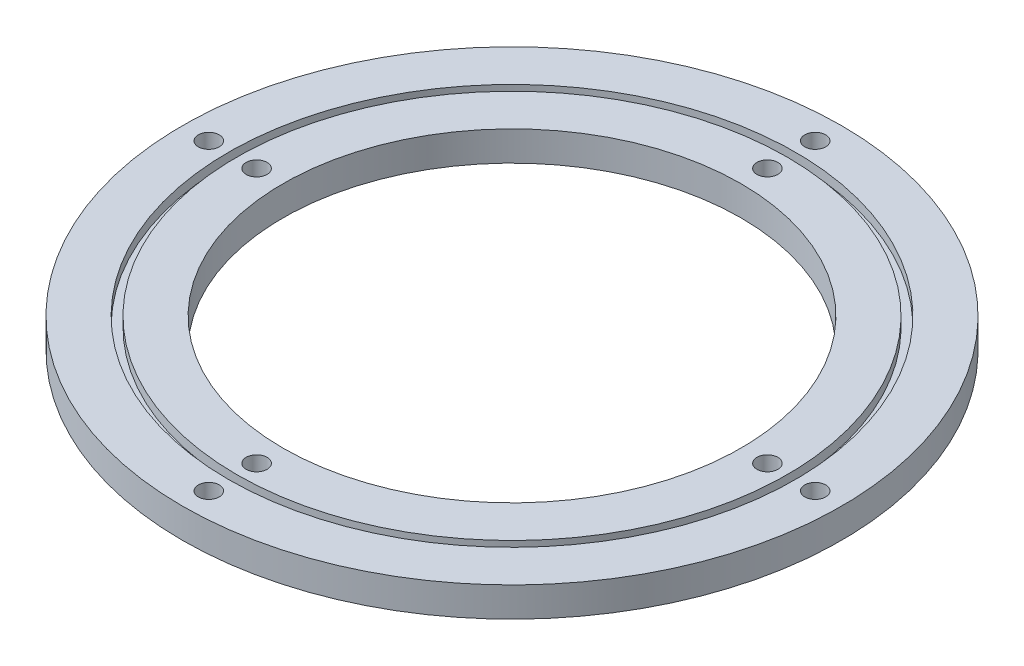
ISO-10303-21;
HEADER;
FILE_DESCRIPTION(('STEP AP214'),'2;1');
FILE_NAME('part.step','',(''),(''),'','','');
FILE_SCHEMA(('AUTOMOTIVE_DESIGN { 1 0 10303 214 1 1 1 1 }'));
ENDSEC;
DATA;
#1=APPLICATION_CONTEXT('core data for automotive mechanical design processes');
#2=APPLICATION_PROTOCOL_DEFINITION('international standard','automotive_design',2000,#1);
#3=PRODUCT_CONTEXT('',#1,'mechanical');
#4=PRODUCT('Part','Part','',(#3));
#5=PRODUCT_RELATED_PRODUCT_CATEGORY('part','',(#4));
#6=PRODUCT_DEFINITION_FORMATION('','',#4);
#7=PRODUCT_DEFINITION_CONTEXT('part definition',#1,'design');
#8=PRODUCT_DEFINITION('design','',#6,#7);
#9=PRODUCT_DEFINITION_SHAPE('','',#8);
#10=(LENGTH_UNIT() NAMED_UNIT(*) SI_UNIT(.MILLI.,.METRE.));
#11=(NAMED_UNIT(*) PLANE_ANGLE_UNIT() SI_UNIT($,.RADIAN.));
#12=(NAMED_UNIT(*) SI_UNIT($,.STERADIAN.) SOLID_ANGLE_UNIT());
#13=UNCERTAINTY_MEASURE_WITH_UNIT(LENGTH_MEASURE(1.E-05),#10,'distance_accuracy_value','');
#14=(GEOMETRIC_REPRESENTATION_CONTEXT(3) GLOBAL_UNCERTAINTY_ASSIGNED_CONTEXT((#13)) GLOBAL_UNIT_ASSIGNED_CONTEXT((#10,
#11,#12)) REPRESENTATION_CONTEXT('',''));
#15=CARTESIAN_POINT('',(0.,0.,0.));
#16=DIRECTION('',(0.,0.,1.));
#17=DIRECTION('',(1.,0.,0.));
#18=AXIS2_PLACEMENT_3D('',#15,#16,#17);
#19=CARTESIAN_POINT('',(0.,4.5,0.));
#20=DIRECTION('',(0.,-1.,0.));
#21=DIRECTION('',(0.,0.,-1.));
#22=AXIS2_PLACEMENT_3D('',#19,#20,#21);
#23=CYLINDRICAL_SURFACE('',#22,86.02);
#24=CARTESIAN_POINT('',(0.,-4.5,0.));
#25=DIRECTION('',(0.,1.,0.));
#26=DIRECTION('',(0.,0.,1.));
#27=AXIS2_PLACEMENT_3D('',#24,#25,#26);
#28=CIRCLE('',#27,86.02);
#29=CARTESIAN_POINT('',(0.,-4.5,86.02));
#30=VERTEX_POINT('',#29);
#31=EDGE_CURVE('E65',#30,#30,#28,.T.);
#32=ORIENTED_EDGE('',*,*,#31,.F.);
#33=EDGE_LOOP('',(#32));
#34=FACE_BOUND('',#33,.T.);
#35=CARTESIAN_POINT('',(0.,-1.5875,0.));
#36=DIRECTION('',(0.,1.,0.));
#37=DIRECTION('',(0.,0.,1.));
#38=AXIS2_PLACEMENT_3D('',#35,#36,#37);
#39=CIRCLE('',#38,86.02);
#40=CARTESIAN_POINT('',(0.,-1.5875,86.02));
#41=VERTEX_POINT('',#40);
#42=EDGE_CURVE('E87',#41,#41,#39,.T.);
#43=ORIENTED_EDGE('',*,*,#42,.T.);
#44=EDGE_LOOP('',(#43));
#45=FACE_BOUND('',#44,.T.);
#46=ADVANCED_FACE('F38',(#34,#45),#23,.F.);
#47=CARTESIAN_POINT('',(0.,4.5,92.));
#48=DIRECTION('',(0.,-1.,0.));
#49=DIRECTION('',(0.,0.,-1.));
#50=AXIS2_PLACEMENT_3D('',#47,#48,#49);
#51=CYLINDRICAL_SURFACE('',#50,3.175);
#52=CARTESIAN_POINT('',(0.,4.5,92.));
#53=DIRECTION('',(0.,1.,0.));
#54=DIRECTION('',(0.,0.,1.));
#55=AXIS2_PLACEMENT_3D('',#52,#53,#54);
#56=CIRCLE('',#55,3.175);
#57=CARTESIAN_POINT('',(0.,4.5,95.175));
#58=VERTEX_POINT('',#57);
#59=EDGE_CURVE('E49',#58,#58,#56,.F.);
#60=ORIENTED_EDGE('',*,*,#59,.F.);
#61=EDGE_LOOP('',(#60));
#62=FACE_BOUND('',#61,.T.);
#63=CARTESIAN_POINT('',(0.,-4.5,92.));
#64=DIRECTION('',(0.,1.,0.));
#65=DIRECTION('',(0.,0.,1.));
#66=AXIS2_PLACEMENT_3D('',#63,#64,#65);
#67=CIRCLE('',#66,3.175);
#68=CARTESIAN_POINT('',(0.,-4.5,95.175));
#69=VERTEX_POINT('',#68);
#70=EDGE_CURVE('E71',#69,#69,#67,.F.);
#71=ORIENTED_EDGE('',*,*,#70,.T.);
#72=EDGE_LOOP('',(#71));
#73=FACE_BOUND('',#72,.T.);
#74=ADVANCED_FACE('F101',(#62,#73),#51,.F.);
#75=CARTESIAN_POINT('',(0.,4.5,0.));
#76=DIRECTION('',(0.,-1.,0.));
#77=DIRECTION('',(0.,0.,-1.));
#78=AXIS2_PLACEMENT_3D('',#75,#76,#77);
#79=CYLINDRICAL_SURFACE('',#78,100.);
#80=CARTESIAN_POINT('',(0.,4.5,0.));
#81=DIRECTION('',(0.,1.,0.));
#82=DIRECTION('',(0.,0.,1.));
#83=AXIS2_PLACEMENT_3D('',#80,#81,#82);
#84=CIRCLE('',#83,100.);
#85=CARTESIAN_POINT('',(0.,4.5,100.));
#86=VERTEX_POINT('',#85);
#87=EDGE_CURVE('E54',#86,#86,#84,.T.);
#88=ORIENTED_EDGE('',*,*,#87,.F.);
#89=EDGE_LOOP('',(#88));
#90=FACE_BOUND('',#89,.T.);
#91=CARTESIAN_POINT('',(0.,-4.5,0.));
#92=DIRECTION('',(0.,1.,0.));
#93=DIRECTION('',(0.,0.,1.));
#94=AXIS2_PLACEMENT_3D('',#91,#92,#93);
#95=CIRCLE('',#94,100.);
#96=CARTESIAN_POINT('',(0.,-4.5,100.));
#97=VERTEX_POINT('',#96);
#98=EDGE_CURVE('E68',#97,#97,#95,.T.);
#99=ORIENTED_EDGE('',*,*,#98,.T.);
#100=EDGE_LOOP('',(#99));
#101=FACE_BOUND('',#100,.T.);
#102=ADVANCED_FACE('F97',(#90,#101),#79,.T.);
#103=CARTESIAN_POINT('',(0.,1.5875,0.));
#104=DIRECTION('',(0.,1.,0.));
#105=DIRECTION('',(0.,0.,1.));
#106=AXIS2_PLACEMENT_3D('',#103,#104,#105);
#107=CIRCLE('',#106,86.02);
#108=CARTESIAN_POINT('',(0.,1.5875,86.02));
#109=VERTEX_POINT('',#108);
#110=EDGE_CURVE('E11',#109,#109,#107,.T.);
#111=ORIENTED_EDGE('',*,*,#110,.F.);
#112=EDGE_LOOP('',(#111));
#113=FACE_BOUND('',#112,.T.);
#114=CARTESIAN_POINT('',(0.,4.5,0.));
#115=DIRECTION('',(0.,1.,0.));
#116=DIRECTION('',(0.,0.,1.));
#117=AXIS2_PLACEMENT_3D('',#114,#115,#116);
#118=CIRCLE('',#117,86.02);
#119=CARTESIAN_POINT('',(0.,4.5,86.02));
#120=VERTEX_POINT('',#119);
#121=EDGE_CURVE('E84',#120,#120,#118,.T.);
#122=ORIENTED_EDGE('',*,*,#121,.T.);
#123=EDGE_LOOP('',(#122));
#124=FACE_BOUND('',#123,.T.);
#125=ADVANCED_FACE('F100',(#113,#124),#23,.F.);
#126=CARTESIAN_POINT('',(92.,4.5,0.));
#127=DIRECTION('',(0.,-1.,0.));
#128=DIRECTION('',(0.,0.,-1.));
#129=AXIS2_PLACEMENT_3D('',#126,#127,#128);
#130=CYLINDRICAL_SURFACE('',#129,3.175);
#131=CARTESIAN_POINT('',(92.,4.5,0.));
#132=DIRECTION('',(0.,1.,0.));
#133=DIRECTION('',(0.,0.,1.));
#134=AXIS2_PLACEMENT_3D('',#131,#132,#133);
#135=CIRCLE('',#134,3.175);
#136=CARTESIAN_POINT('',(92.,4.5,3.175));
#137=VERTEX_POINT('',#136);
#138=EDGE_CURVE('E79',#137,#137,#135,.F.);
#139=ORIENTED_EDGE('',*,*,#138,.F.);
#140=EDGE_LOOP('',(#139));
#141=FACE_BOUND('',#140,.T.);
#142=CARTESIAN_POINT('',(92.,-4.5,0.));
#143=DIRECTION('',(0.,1.,0.));
#144=DIRECTION('',(0.,0.,1.));
#145=AXIS2_PLACEMENT_3D('',#142,#143,#144);
#146=CIRCLE('',#145,3.175);
#147=CARTESIAN_POINT('',(92.,-4.5,3.175));
#148=VERTEX_POINT('',#147);
#149=EDGE_CURVE('E61',#148,#148,#146,.F.);
#150=ORIENTED_EDGE('',*,*,#149,.T.);
#151=EDGE_LOOP('',(#150));
#152=FACE_BOUND('',#151,.T.);
#153=ADVANCED_FACE('F126',(#141,#152),#130,.F.);
#154=CARTESIAN_POINT('',(-92.,4.5,0.));
#155=DIRECTION('',(0.,-1.,0.));
#156=DIRECTION('',(0.,0.,-1.));
#157=AXIS2_PLACEMENT_3D('',#154,#155,#156);
#158=CYLINDRICAL_SURFACE('',#157,3.175);
#159=CARTESIAN_POINT('',(-92.,4.5,0.));
#160=DIRECTION('',(0.,1.,0.));
#161=DIRECTION('',(0.,0.,1.));
#162=AXIS2_PLACEMENT_3D('',#159,#160,#161);
#163=CIRCLE('',#162,3.175);
#164=CARTESIAN_POINT('',(-92.,4.5,3.17500000000001));
#165=VERTEX_POINT('',#164);
#166=EDGE_CURVE('E75',#165,#165,#163,.F.);
#167=ORIENTED_EDGE('',*,*,#166,.F.);
#168=EDGE_LOOP('',(#167));
#169=FACE_BOUND('',#168,.T.);
#170=CARTESIAN_POINT('',(-92.,-4.5,0.));
#171=DIRECTION('',(0.,1.,0.));
#172=DIRECTION('',(0.,0.,1.));
#173=AXIS2_PLACEMENT_3D('',#170,#171,#172);
#174=CIRCLE('',#173,3.175);
#175=CARTESIAN_POINT('',(-92.,-4.5,3.17500000000001));
#176=VERTEX_POINT('',#175);
#177=EDGE_CURVE('E58',#176,#176,#174,.F.);
#178=ORIENTED_EDGE('',*,*,#177,.T.);
#179=EDGE_LOOP('',(#178));
#180=FACE_BOUND('',#179,.T.);
#181=ADVANCED_FACE('F40',(#169,#180),#158,.F.);
#182=CARTESIAN_POINT('',(0.,4.5,-92.));
#183=DIRECTION('',(0.,-1.,0.));
#184=DIRECTION('',(0.,0.,-1.));
#185=AXIS2_PLACEMENT_3D('',#182,#183,#184);
#186=CYLINDRICAL_SURFACE('',#185,3.17499999999999);
#187=CARTESIAN_POINT('',(0.,4.5,-92.));
#188=DIRECTION('',(0.,1.,0.));
#189=DIRECTION('',(0.,0.,1.));
#190=AXIS2_PLACEMENT_3D('',#187,#188,#189);
#191=CIRCLE('',#190,3.17499999999999);
#192=CARTESIAN_POINT('',(0.,4.5,-88.825));
#193=VERTEX_POINT('',#192);
#194=EDGE_CURVE('E45',#193,#193,#191,.F.);
#195=ORIENTED_EDGE('',*,*,#194,.F.);
#196=EDGE_LOOP('',(#195));
#197=FACE_BOUND('',#196,.T.);
#198=CARTESIAN_POINT('',(0.,-4.5,-92.));
#199=DIRECTION('',(0.,1.,0.));
#200=DIRECTION('',(0.,0.,1.));
#201=AXIS2_PLACEMENT_3D('',#198,#199,#200);
#202=CIRCLE('',#201,3.17499999999999);
#203=CARTESIAN_POINT('',(0.,-4.5,-88.825));
#204=VERTEX_POINT('',#203);
#205=EDGE_CURVE('E73',#204,#204,#202,.F.);
#206=ORIENTED_EDGE('',*,*,#205,.T.);
#207=EDGE_LOOP('',(#206));
#208=FACE_BOUND('',#207,.T.);
#209=ADVANCED_FACE('F124',(#197,#208),#186,.F.);
#210=CARTESIAN_POINT('',(0.,4.5,0.));
#211=DIRECTION('',(0.,1.,0.));
#212=DIRECTION('',(0.,0.,1.));
#213=AXIS2_PLACEMENT_3D('',#210,#211,#212);
#214=PLANE('',#213);
#215=ORIENTED_EDGE('',*,*,#166,.T.);
#216=EDGE_LOOP('',(#215));
#217=FACE_BOUND('',#216,.T.);
#218=ORIENTED_EDGE('',*,*,#138,.T.);
#219=EDGE_LOOP('',(#218));
#220=FACE_BOUND('',#219,.T.);
#221=ORIENTED_EDGE('',*,*,#121,.F.);
#222=EDGE_LOOP('',(#221));
#223=FACE_BOUND('',#222,.T.);
#224=ORIENTED_EDGE('',*,*,#87,.T.);
#225=EDGE_LOOP('',(#224));
#226=FACE_BOUND('',#225,.T.);
#227=ORIENTED_EDGE('',*,*,#59,.T.);
#228=EDGE_LOOP('',(#227));
#229=FACE_BOUND('',#228,.T.);
#230=ORIENTED_EDGE('',*,*,#194,.T.);
#231=EDGE_LOOP('',(#230));
#232=FACE_BOUND('',#231,.T.);
#233=ADVANCED_FACE('F94',(#217,#220,#223,#226,#229,#232),#214,.T.);
#234=CARTESIAN_POINT('',(0.,-4.5,0.));
#235=DIRECTION('',(0.,1.,0.));
#236=DIRECTION('',(0.,0.,1.));
#237=AXIS2_PLACEMENT_3D('',#234,#235,#236);
#238=PLANE('',#237);
#239=ORIENTED_EDGE('',*,*,#177,.F.);
#240=EDGE_LOOP('',(#239));
#241=FACE_BOUND('',#240,.T.);
#242=ORIENTED_EDGE('',*,*,#149,.F.);
#243=EDGE_LOOP('',(#242));
#244=FACE_BOUND('',#243,.T.);
#245=ORIENTED_EDGE('',*,*,#31,.T.);
#246=EDGE_LOOP('',(#245));
#247=FACE_BOUND('',#246,.T.);
#248=ORIENTED_EDGE('',*,*,#98,.F.);
#249=EDGE_LOOP('',(#248));
#250=FACE_BOUND('',#249,.T.);
#251=ORIENTED_EDGE('',*,*,#70,.F.);
#252=EDGE_LOOP('',(#251));
#253=FACE_BOUND('',#252,.T.);
#254=ORIENTED_EDGE('',*,*,#205,.F.);
#255=EDGE_LOOP('',(#254));
#256=FACE_BOUND('',#255,.T.);
#257=ADVANCED_FACE('F105',(#241,#244,#247,#250,#253,#256),#238,.F.);
#258=CARTESIAN_POINT('',(0.,1.5875,0.));
#259=DIRECTION('',(0.,1.,0.));
#260=DIRECTION('',(0.,0.,1.));
#261=AXIS2_PLACEMENT_3D('',#258,#259,#260);
#262=PLANE('',#261);
#263=CARTESIAN_POINT('',(0.,1.5875,0.));
#264=DIRECTION('',(0.,1.,0.));
#265=DIRECTION('',(0.,0.,1.));
#266=AXIS2_PLACEMENT_3D('',#263,#264,#265);
#267=CIRCLE('',#266,83.48);
#268=CARTESIAN_POINT('',(0.,1.5875,83.48));
#269=VERTEX_POINT('',#268);
#270=EDGE_CURVE('E62',#269,#269,#267,.T.);
#271=ORIENTED_EDGE('',*,*,#270,.F.);
#272=EDGE_LOOP('',(#271));
#273=FACE_BOUND('',#272,.T.);
#274=ORIENTED_EDGE('',*,*,#110,.T.);
#275=EDGE_LOOP('',(#274));
#276=FACE_BOUND('',#275,.T.);
#277=ADVANCED_FACE('F108',(#273,#276),#262,.T.);
#278=CARTESIAN_POINT('',(0.,-1.5875,0.));
#279=DIRECTION('',(0.,1.,0.));
#280=DIRECTION('',(0.,0.,1.));
#281=AXIS2_PLACEMENT_3D('',#278,#279,#280);
#282=PLANE('',#281);
#283=CARTESIAN_POINT('',(0.,-1.5875,0.));
#284=DIRECTION('',(0.,1.,0.));
#285=DIRECTION('',(0.,0.,1.));
#286=AXIS2_PLACEMENT_3D('',#283,#284,#285);
#287=CIRCLE('',#286,83.48);
#288=CARTESIAN_POINT('',(0.,-1.5875,83.48));
#289=VERTEX_POINT('',#288);
#290=EDGE_CURVE('E144',#289,#289,#287,.F.);
#291=ORIENTED_EDGE('',*,*,#290,.F.);
#292=EDGE_LOOP('',(#291));
#293=FACE_BOUND('',#292,.T.);
#294=ORIENTED_EDGE('',*,*,#42,.F.);
#295=EDGE_LOOP('',(#294));
#296=FACE_BOUND('',#295,.T.);
#297=ADVANCED_FACE('F220',(#293,#296),#282,.F.);
#298=CARTESIAN_POINT('',(0.,4.5,0.));
#299=DIRECTION('',(0.,-1.,0.));
#300=DIRECTION('',(0.,0.,-1.));
#301=AXIS2_PLACEMENT_3D('',#298,#299,#300);
#302=CYLINDRICAL_SURFACE('',#301,83.48);
#303=CARTESIAN_POINT('',(0.,-4.5,0.));
#304=DIRECTION('',(0.,1.,0.));
#305=DIRECTION('',(0.,0.,1.));
#306=AXIS2_PLACEMENT_3D('',#303,#304,#305);
#307=CIRCLE('',#306,83.48);
#308=CARTESIAN_POINT('',(0.,-4.5,83.48));
#309=VERTEX_POINT('',#308);
#310=EDGE_CURVE('E155',#309,#309,#307,.T.);
#311=ORIENTED_EDGE('',*,*,#310,.T.);
#312=EDGE_LOOP('',(#311));
#313=FACE_BOUND('',#312,.T.);
#314=ORIENTED_EDGE('',*,*,#290,.T.);
#315=EDGE_LOOP('',(#314));
#316=FACE_BOUND('',#315,.T.);
#317=ADVANCED_FACE('F210',(#313,#316),#302,.T.);
#318=CARTESIAN_POINT('',(0.,4.5,0.));
#319=DIRECTION('',(0.,-1.,0.));
#320=DIRECTION('',(0.,0.,-1.));
#321=AXIS2_PLACEMENT_3D('',#318,#319,#320);
#322=CYLINDRICAL_SURFACE('',#321,69.5);
#323=CARTESIAN_POINT('',(0.,4.5,0.));
#324=DIRECTION('',(0.,1.,0.));
#325=DIRECTION('',(0.,0.,1.));
#326=AXIS2_PLACEMENT_3D('',#323,#324,#325);
#327=CIRCLE('',#326,69.5);
#328=CARTESIAN_POINT('',(0.,4.5,69.5));
#329=VERTEX_POINT('',#328);
#330=EDGE_CURVE('E152',#329,#329,#327,.T.);
#331=ORIENTED_EDGE('',*,*,#330,.T.);
#332=EDGE_LOOP('',(#331));
#333=FACE_BOUND('',#332,.T.);
#334=CARTESIAN_POINT('',(0.,-4.5,0.));
#335=DIRECTION('',(0.,1.,0.));
#336=DIRECTION('',(0.,0.,1.));
#337=AXIS2_PLACEMENT_3D('',#334,#335,#336);
#338=CIRCLE('',#337,69.5);
#339=CARTESIAN_POINT('',(0.,-4.5,69.5));
#340=VERTEX_POINT('',#339);
#341=EDGE_CURVE('E159',#340,#340,#338,.T.);
#342=ORIENTED_EDGE('',*,*,#341,.F.);
#343=EDGE_LOOP('',(#342));
#344=FACE_BOUND('',#343,.T.);
#345=ADVANCED_FACE('F219',(#333,#344),#322,.F.);
#346=CARTESIAN_POINT('',(77.5,4.5,0.));
#347=DIRECTION('',(0.,-1.,0.));
#348=DIRECTION('',(0.,0.,-1.));
#349=AXIS2_PLACEMENT_3D('',#346,#347,#348);
#350=CYLINDRICAL_SURFACE('',#349,3.175);
#351=CARTESIAN_POINT('',(77.5,4.5,0.));
#352=DIRECTION('',(0.,1.,0.));
#353=DIRECTION('',(0.,0.,1.));
#354=AXIS2_PLACEMENT_3D('',#351,#352,#353);
#355=CIRCLE('',#354,3.175);
#356=CARTESIAN_POINT('',(77.5,4.5,3.175));
#357=VERTEX_POINT('',#356);
#358=EDGE_CURVE('E176',#357,#357,#355,.T.);
#359=ORIENTED_EDGE('',*,*,#358,.T.);
#360=EDGE_LOOP('',(#359));
#361=FACE_BOUND('',#360,.T.);
#362=CARTESIAN_POINT('',(77.5,-4.5,0.));
#363=DIRECTION('',(0.,1.,0.));
#364=DIRECTION('',(0.,0.,1.));
#365=AXIS2_PLACEMENT_3D('',#362,#363,#364);
#366=CIRCLE('',#365,3.175);
#367=CARTESIAN_POINT('',(77.5,-4.5,3.175));
#368=VERTEX_POINT('',#367);
#369=EDGE_CURVE('E162',#368,#368,#366,.T.);
#370=ORIENTED_EDGE('',*,*,#369,.F.);
#371=EDGE_LOOP('',(#370));
#372=FACE_BOUND('',#371,.T.);
#373=ADVANCED_FACE('F226',(#361,#372),#350,.F.);
#374=CARTESIAN_POINT('',(0.,4.5,77.5));
#375=DIRECTION('',(0.,-1.,0.));
#376=DIRECTION('',(0.,0.,-1.));
#377=AXIS2_PLACEMENT_3D('',#374,#375,#376);
#378=CYLINDRICAL_SURFACE('',#377,3.17499999999999);
#379=CARTESIAN_POINT('',(0.,4.5,77.5));
#380=DIRECTION('',(0.,1.,0.));
#381=DIRECTION('',(0.,0.,1.));
#382=AXIS2_PLACEMENT_3D('',#379,#380,#381);
#383=CIRCLE('',#382,3.17499999999999);
#384=CARTESIAN_POINT('',(0.,4.5,80.675));
#385=VERTEX_POINT('',#384);
#386=EDGE_CURVE('E179',#385,#385,#383,.T.);
#387=ORIENTED_EDGE('',*,*,#386,.T.);
#388=EDGE_LOOP('',(#387));
#389=FACE_BOUND('',#388,.T.);
#390=CARTESIAN_POINT('',(0.,-4.5,77.5));
#391=DIRECTION('',(0.,1.,0.));
#392=DIRECTION('',(0.,0.,1.));
#393=AXIS2_PLACEMENT_3D('',#390,#391,#392);
#394=CIRCLE('',#393,3.17499999999999);
#395=CARTESIAN_POINT('',(0.,-4.5,80.675));
#396=VERTEX_POINT('',#395);
#397=EDGE_CURVE('E165',#396,#396,#394,.T.);
#398=ORIENTED_EDGE('',*,*,#397,.F.);
#399=EDGE_LOOP('',(#398));
#400=FACE_BOUND('',#399,.T.);
#401=ADVANCED_FACE('F248',(#389,#400),#378,.F.);
#402=CARTESIAN_POINT('',(-77.5,4.5,0.));
#403=DIRECTION('',(0.,-1.,0.));
#404=DIRECTION('',(0.,0.,-1.));
#405=AXIS2_PLACEMENT_3D('',#402,#403,#404);
#406=CYLINDRICAL_SURFACE('',#405,3.175);
#407=CARTESIAN_POINT('',(-77.5,4.5,0.));
#408=DIRECTION('',(0.,1.,0.));
#409=DIRECTION('',(0.,0.,1.));
#410=AXIS2_PLACEMENT_3D('',#407,#408,#409);
#411=CIRCLE('',#410,3.175);
#412=CARTESIAN_POINT('',(-77.5,4.5,3.17500000000001));
#413=VERTEX_POINT('',#412);
#414=EDGE_CURVE('E182',#413,#413,#411,.T.);
#415=ORIENTED_EDGE('',*,*,#414,.T.);
#416=EDGE_LOOP('',(#415));
#417=FACE_BOUND('',#416,.T.);
#418=CARTESIAN_POINT('',(-77.5,-4.5,0.));
#419=DIRECTION('',(0.,1.,0.));
#420=DIRECTION('',(0.,0.,1.));
#421=AXIS2_PLACEMENT_3D('',#418,#419,#420);
#422=CIRCLE('',#421,3.175);
#423=CARTESIAN_POINT('',(-77.5,-4.5,3.17500000000001));
#424=VERTEX_POINT('',#423);
#425=EDGE_CURVE('E168',#424,#424,#422,.T.);
#426=ORIENTED_EDGE('',*,*,#425,.F.);
#427=EDGE_LOOP('',(#426));
#428=FACE_BOUND('',#427,.T.);
#429=ADVANCED_FACE('F214',(#417,#428),#406,.F.);
#430=CARTESIAN_POINT('',(0.,4.5,-77.5));
#431=DIRECTION('',(0.,-1.,0.));
#432=DIRECTION('',(0.,0.,-1.));
#433=AXIS2_PLACEMENT_3D('',#430,#431,#432);
#434=CYLINDRICAL_SURFACE('',#433,3.175);
#435=CARTESIAN_POINT('',(0.,4.5,-77.5));
#436=DIRECTION('',(0.,1.,0.));
#437=DIRECTION('',(0.,0.,1.));
#438=AXIS2_PLACEMENT_3D('',#435,#436,#437);
#439=CIRCLE('',#438,3.175);
#440=CARTESIAN_POINT('',(0.,4.5,-74.325));
#441=VERTEX_POINT('',#440);
#442=EDGE_CURVE('E158',#441,#441,#439,.T.);
#443=ORIENTED_EDGE('',*,*,#442,.T.);
#444=EDGE_LOOP('',(#443));
#445=FACE_BOUND('',#444,.T.);
#446=CARTESIAN_POINT('',(0.,-4.5,-77.5));
#447=DIRECTION('',(0.,1.,0.));
#448=DIRECTION('',(0.,0.,1.));
#449=AXIS2_PLACEMENT_3D('',#446,#447,#448);
#450=CIRCLE('',#449,3.175);
#451=CARTESIAN_POINT('',(0.,-4.5,-74.325));
#452=VERTEX_POINT('',#451);
#453=EDGE_CURVE('E171',#452,#452,#450,.T.);
#454=ORIENTED_EDGE('',*,*,#453,.F.);
#455=EDGE_LOOP('',(#454));
#456=FACE_BOUND('',#455,.T.);
#457=ADVANCED_FACE('F188',(#445,#456),#434,.F.);
#458=ORIENTED_EDGE('',*,*,#270,.T.);
#459=EDGE_LOOP('',(#458));
#460=FACE_BOUND('',#459,.T.);
#461=CARTESIAN_POINT('',(0.,4.5,0.));
#462=DIRECTION('',(0.,1.,0.));
#463=DIRECTION('',(0.,0.,1.));
#464=AXIS2_PLACEMENT_3D('',#461,#462,#463);
#465=CIRCLE('',#464,83.48);
#466=CARTESIAN_POINT('',(0.,4.5,83.48));
#467=VERTEX_POINT('',#466);
#468=EDGE_CURVE('E147',#467,#467,#465,.T.);
#469=ORIENTED_EDGE('',*,*,#468,.F.);
#470=EDGE_LOOP('',(#469));
#471=FACE_BOUND('',#470,.T.);
#472=ADVANCED_FACE('F195',(#460,#471),#302,.T.);
#473=CARTESIAN_POINT('',(0.,4.5,0.));
#474=DIRECTION('',(0.,1.,0.));
#475=DIRECTION('',(0.,0.,1.));
#476=AXIS2_PLACEMENT_3D('',#473,#474,#475);
#477=PLANE('',#476);
#478=ORIENTED_EDGE('',*,*,#442,.F.);
#479=EDGE_LOOP('',(#478));
#480=FACE_BOUND('',#479,.T.);
#481=ORIENTED_EDGE('',*,*,#414,.F.);
#482=EDGE_LOOP('',(#481));
#483=FACE_BOUND('',#482,.T.);
#484=ORIENTED_EDGE('',*,*,#386,.F.);
#485=EDGE_LOOP('',(#484));
#486=FACE_BOUND('',#485,.T.);
#487=ORIENTED_EDGE('',*,*,#358,.F.);
#488=EDGE_LOOP('',(#487));
#489=FACE_BOUND('',#488,.T.);
#490=ORIENTED_EDGE('',*,*,#330,.F.);
#491=EDGE_LOOP('',(#490));
#492=FACE_BOUND('',#491,.T.);
#493=ORIENTED_EDGE('',*,*,#468,.T.);
#494=EDGE_LOOP('',(#493));
#495=FACE_BOUND('',#494,.T.);
#496=ADVANCED_FACE('F191',(#480,#483,#486,#489,#492,#495),#477,.T.);
#497=CARTESIAN_POINT('',(0.,-4.5,0.));
#498=DIRECTION('',(0.,1.,0.));
#499=DIRECTION('',(0.,0.,1.));
#500=AXIS2_PLACEMENT_3D('',#497,#498,#499);
#501=PLANE('',#500);
#502=ORIENTED_EDGE('',*,*,#453,.T.);
#503=EDGE_LOOP('',(#502));
#504=FACE_BOUND('',#503,.T.);
#505=ORIENTED_EDGE('',*,*,#425,.T.);
#506=EDGE_LOOP('',(#505));
#507=FACE_BOUND('',#506,.T.);
#508=ORIENTED_EDGE('',*,*,#397,.T.);
#509=EDGE_LOOP('',(#508));
#510=FACE_BOUND('',#509,.T.);
#511=ORIENTED_EDGE('',*,*,#369,.T.);
#512=EDGE_LOOP('',(#511));
#513=FACE_BOUND('',#512,.T.);
#514=ORIENTED_EDGE('',*,*,#341,.T.);
#515=EDGE_LOOP('',(#514));
#516=FACE_BOUND('',#515,.T.);
#517=ORIENTED_EDGE('',*,*,#310,.F.);
#518=EDGE_LOOP('',(#517));
#519=FACE_BOUND('',#518,.T.);
#520=ADVANCED_FACE('F194',(#504,#507,#510,#513,#516,#519),#501,.F.);
#521=CLOSED_SHELL('',(#46,#74,#102,#125,#153,#181,#209,#233,#257,#277,#297,#317,#345,#373,#401,
#429,#457,#472,#496,#520));
#522=MANIFOLD_SOLID_BREP('B2',#521);
#523=ADVANCED_BREP_SHAPE_REPRESENTATION('',(#18,#522),#14);
#524=SHAPE_DEFINITION_REPRESENTATION(#9,#523);
ENDSEC;
END-ISO-10303-21;
